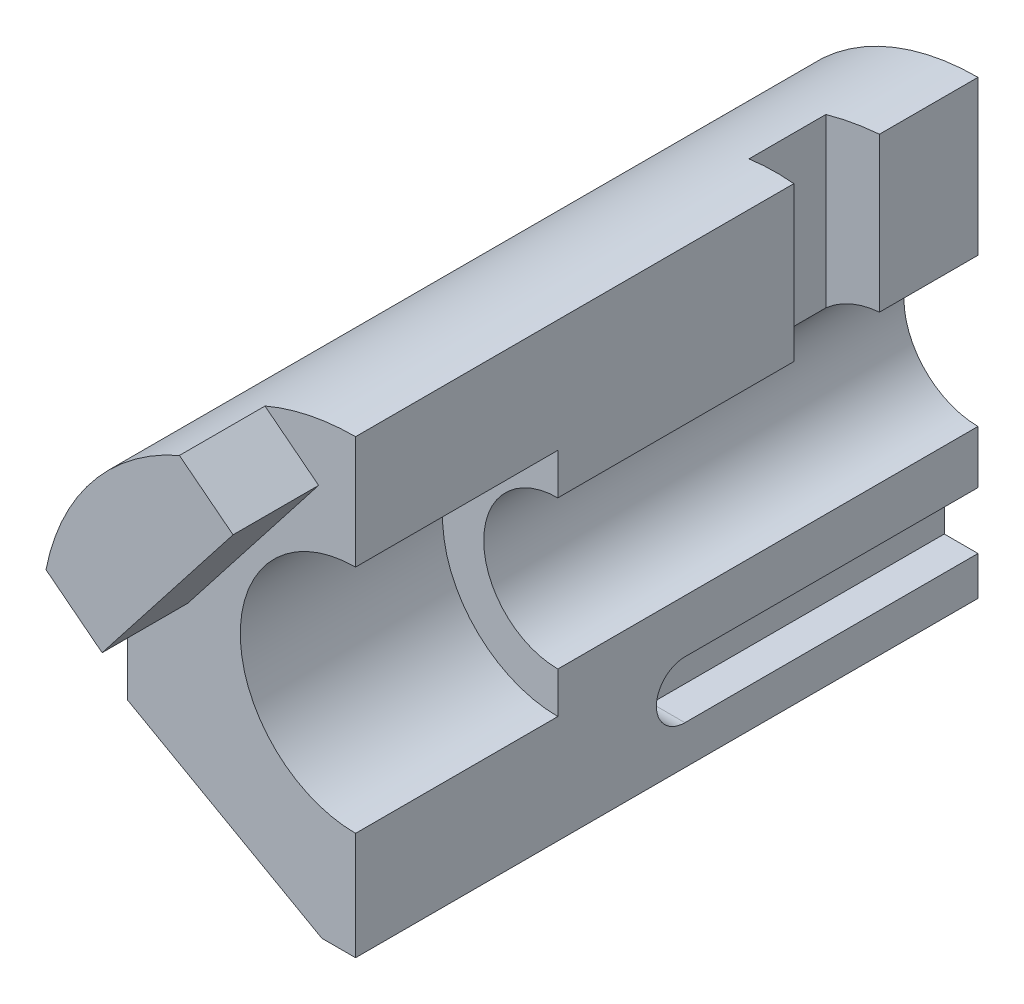
ISO-10303-21;
HEADER;
FILE_DESCRIPTION(('STEP AP214'),'2;1');
FILE_NAME('part.step','',(''),(''),'','','');
FILE_SCHEMA(('AUTOMOTIVE_DESIGN { 1 0 10303 214 1 1 1 1 }'));
ENDSEC;
DATA;
#1=APPLICATION_CONTEXT('core data for automotive mechanical design processes');
#2=APPLICATION_PROTOCOL_DEFINITION('international standard','automotive_design',2000,#1);
#3=PRODUCT_CONTEXT('',#1,'mechanical');
#4=PRODUCT('Part','Part','',(#3));
#5=PRODUCT_RELATED_PRODUCT_CATEGORY('part','',(#4));
#6=PRODUCT_DEFINITION_FORMATION('','',#4);
#7=PRODUCT_DEFINITION_CONTEXT('part definition',#1,'design');
#8=PRODUCT_DEFINITION('design','',#6,#7);
#9=PRODUCT_DEFINITION_SHAPE('','',#8);
#10=(LENGTH_UNIT() NAMED_UNIT(*) SI_UNIT(.MILLI.,.METRE.));
#11=(NAMED_UNIT(*) PLANE_ANGLE_UNIT() SI_UNIT($,.RADIAN.));
#12=(NAMED_UNIT(*) SI_UNIT($,.STERADIAN.) SOLID_ANGLE_UNIT());
#13=UNCERTAINTY_MEASURE_WITH_UNIT(LENGTH_MEASURE(1.E-05),#10,'distance_accuracy_value','');
#14=(GEOMETRIC_REPRESENTATION_CONTEXT(3) GLOBAL_UNCERTAINTY_ASSIGNED_CONTEXT((#13)) GLOBAL_UNIT_ASSIGNED_CONTEXT((#10,
#11,#12)) REPRESENTATION_CONTEXT('',''));
#15=CARTESIAN_POINT('',(0.,0.,0.));
#16=DIRECTION('',(0.,0.,1.));
#17=DIRECTION('',(1.,0.,0.));
#18=AXIS2_PLACEMENT_3D('',#15,#16,#17);
#19=CARTESIAN_POINT('',(0.,-86.,240.));
#20=DIRECTION('',(-1.,0.,0.));
#21=DIRECTION('',(0.,0.,1.));
#22=AXIS2_PLACEMENT_3D('',#19,#20,#21);
#23=PLANE('',#22);
#24=DIRECTION('',(0.,0.,-1.));
#25=VECTOR('',#24,1.);
#26=CARTESIAN_POINT('',(0.,-49.,0.));
#27=LINE('',#26,#25);
#28=CARTESIAN_POINT('',(0.,-49.,113.));
#29=VERTEX_POINT('',#28);
#30=CARTESIAN_POINT('',(0.,-49.,0.));
#31=VERTEX_POINT('',#30);
#32=EDGE_CURVE('E196',#29,#31,#27,.T.);
#33=ORIENTED_EDGE('',*,*,#32,.T.);
#34=DIRECTION('',(0.,1.,0.));
#35=VECTOR('',#34,1.);
#36=CARTESIAN_POINT('',(0.,-86.,0.));
#37=LINE('',#36,#35);
#38=CARTESIAN_POINT('',(0.,-28.575,0.));
#39=VERTEX_POINT('',#38);
#40=EDGE_CURVE('E320',#31,#39,#37,.T.);
#41=ORIENTED_EDGE('',*,*,#40,.T.);
#42=DIRECTION('',(0.,0.,1.));
#43=VECTOR('',#42,1.);
#44=CARTESIAN_POINT('',(0.,-28.575,0.));
#45=LINE('',#44,#43);
#46=CARTESIAN_POINT('',(0.,-28.575,162.));
#47=VERTEX_POINT('',#46);
#48=EDGE_CURVE('E279',#39,#47,#45,.T.);
#49=ORIENTED_EDGE('',*,*,#48,.T.);
#50=DIRECTION('',(0.,1.,0.));
#51=VECTOR('',#50,1.);
#52=CARTESIAN_POINT('',(0.,-86.,162.));
#53=LINE('',#52,#51);
#54=CARTESIAN_POINT('',(0.,-44.45,162.));
#55=VERTEX_POINT('',#54);
#56=EDGE_CURVE('E337',#55,#47,#53,.T.);
#57=ORIENTED_EDGE('',*,*,#56,.F.);
#58=DIRECTION('',(0.,0.,1.));
#59=VECTOR('',#58,1.);
#60=CARTESIAN_POINT('',(0.,-44.45,162.));
#61=LINE('',#60,#59);
#62=CARTESIAN_POINT('',(0.,-44.45,240.));
#63=VERTEX_POINT('',#62);
#64=EDGE_CURVE('E290',#55,#63,#61,.T.);
#65=ORIENTED_EDGE('',*,*,#64,.T.);
#66=DIRECTION('',(0.,1.,0.));
#67=VECTOR('',#66,1.);
#68=CARTESIAN_POINT('',(0.,-86.,240.));
#69=LINE('',#68,#67);
#70=CARTESIAN_POINT('',(0.,-86.,240.));
#71=VERTEX_POINT('',#70);
#72=EDGE_CURVE('E304',#71,#63,#69,.T.);
#73=ORIENTED_EDGE('',*,*,#72,.F.);
#74=DIRECTION('',(0.,0.,-1.));
#75=VECTOR('',#74,1.);
#76=CARTESIAN_POINT('',(0.,-86.,240.));
#77=LINE('',#76,#75);
#78=CARTESIAN_POINT('',(0.,-86.,0.));
#79=VERTEX_POINT('',#78);
#80=EDGE_CURVE('E324',#71,#79,#77,.T.);
#81=ORIENTED_EDGE('',*,*,#80,.T.);
#82=CARTESIAN_POINT('',(0.,-71.,0.));
#83=VERTEX_POINT('',#82);
#84=EDGE_CURVE('E317',#79,#83,#37,.T.);
#85=ORIENTED_EDGE('',*,*,#84,.T.);
#86=DIRECTION('',(0.,0.,-1.));
#87=VECTOR('',#86,1.);
#88=CARTESIAN_POINT('',(0.,-71.,0.));
#89=LINE('',#88,#87);
#90=CARTESIAN_POINT('',(0.,-71.,113.));
#91=VERTEX_POINT('',#90);
#92=EDGE_CURVE('E208',#91,#83,#89,.T.);
#93=ORIENTED_EDGE('',*,*,#92,.F.);
#94=CARTESIAN_POINT('',(0.,-60.,113.));
#95=DIRECTION('',(1.,0.,0.));
#96=DIRECTION('',(0.,0.,-1.));
#97=AXIS2_PLACEMENT_3D('',#94,#95,#96);
#98=CIRCLE('',#97,11.);
#99=EDGE_CURVE('E216',#29,#91,#98,.T.);
#100=ORIENTED_EDGE('',*,*,#99,.F.);
#101=EDGE_LOOP('',(#33,#41,#49,#57,#65,#73,#81,#85,#93,#100));
#102=FACE_BOUND('',#101,.T.);
#103=ADVANCED_FACE('F47',(#102),#23,.F.);
#104=CARTESIAN_POINT('',(0.,0.,0.));
#105=DIRECTION('',(0.,0.,1.));
#106=DIRECTION('',(1.,0.,0.));
#107=AXIS2_PLACEMENT_3D('',#104,#105,#106);
#108=PLANE('',#107);
#109=DIRECTION('',(1.,0.,0.));
#110=VECTOR('',#109,1.);
#111=CARTESIAN_POINT('',(-13.,-49.,0.));
#112=LINE('',#111,#110);
#113=CARTESIAN_POINT('',(-13.,-49.,0.));
#114=VERTEX_POINT('',#113);
#115=EDGE_CURVE('E219',#114,#31,#112,.T.);
#116=ORIENTED_EDGE('',*,*,#115,.F.);
#117=DIRECTION('',(0.,1.,0.));
#118=VECTOR('',#117,1.);
#119=CARTESIAN_POINT('',(-13.,0.,0.));
#120=LINE('',#119,#118);
#121=CARTESIAN_POINT('',(-13.,-71.,0.));
#122=VERTEX_POINT('',#121);
#123=EDGE_CURVE('E202',#122,#114,#120,.T.);
#124=ORIENTED_EDGE('',*,*,#123,.F.);
#125=DIRECTION('',(1.,0.,0.));
#126=VECTOR('',#125,1.);
#127=CARTESIAN_POINT('',(-13.,-71.,0.));
#128=LINE('',#127,#126);
#129=EDGE_CURVE('E222',#122,#83,#128,.T.);
#130=ORIENTED_EDGE('',*,*,#129,.T.);
#131=ORIENTED_EDGE('',*,*,#84,.F.);
#132=DIRECTION('',(1.,0.,0.));
#133=VECTOR('',#132,1.);
#134=CARTESIAN_POINT('',(0.,-86.,0.));
#135=LINE('',#134,#133);
#136=CARTESIAN_POINT('',(-13.,-86.,0.));
#137=VERTEX_POINT('',#136);
#138=EDGE_CURVE('E314',#137,#79,#135,.T.);
#139=ORIENTED_EDGE('',*,*,#138,.F.);
#140=DIRECTION('',(0.871778755489481,-0.489899787178166,0.));
#141=VECTOR('',#140,1.);
#142=CARTESIAN_POINT('',(-13.,-86.,0.));
#143=LINE('',#142,#141);
#144=CARTESIAN_POINT('',(-88.,-43.8534303491572,0.));
#145=VERTEX_POINT('',#144);
#146=EDGE_CURVE('E312',#145,#137,#143,.T.);
#147=ORIENTED_EDGE('',*,*,#146,.F.);
#148=DIRECTION('',(0.,-1.,0.));
#149=VECTOR('',#148,1.);
#150=CARTESIAN_POINT('',(-88.,0.,0.));
#151=LINE('',#150,#149);
#152=CARTESIAN_POINT('',(-88.,0.,0.));
#153=VERTEX_POINT('',#152);
#154=EDGE_CURVE('E310',#153,#145,#151,.T.);
#155=ORIENTED_EDGE('',*,*,#154,.F.);
#156=CARTESIAN_POINT('',(0.,0.,0.));
#157=DIRECTION('',(0.,0.,1.));
#158=DIRECTION('',(1.,0.,0.));
#159=AXIS2_PLACEMENT_3D('',#156,#157,#158);
#160=CIRCLE('',#159,88.);
#161=CARTESIAN_POINT('',(0.,88.,0.));
#162=VERTEX_POINT('',#161);
#163=EDGE_CURVE('E293',#162,#153,#160,.T.);
#164=ORIENTED_EDGE('',*,*,#163,.F.);
#165=CARTESIAN_POINT('',(0.,28.575,0.));
#166=VERTEX_POINT('',#165);
#167=EDGE_CURVE('E316',#166,#162,#37,.T.);
#168=ORIENTED_EDGE('',*,*,#167,.F.);
#169=CARTESIAN_POINT('',(0.,0.,0.));
#170=DIRECTION('',(0.,0.,1.));
#171=DIRECTION('',(1.,0.,0.));
#172=AXIS2_PLACEMENT_3D('',#169,#170,#171);
#173=CIRCLE('',#172,28.575);
#174=EDGE_CURVE('E271',#166,#39,#173,.T.);
#175=ORIENTED_EDGE('',*,*,#174,.T.);
#176=ORIENTED_EDGE('',*,*,#40,.F.);
#177=EDGE_LOOP('',(#116,#124,#130,#131,#139,#147,#155,#164,#168,#175,#176));
#178=FACE_BOUND('',#177,.T.);
#179=ADVANCED_FACE('F375',(#178),#108,.F.);
#180=DIRECTION('',(0.,0.,-1.));
#181=VECTOR('',#180,1.);
#182=CARTESIAN_POINT('',(0.,88.,240.));
#183=LINE('',#182,#181);
#184=CARTESIAN_POINT('',(0.,88.,38.));
#185=VERTEX_POINT('',#184);
#186=EDGE_CURVE('E307',#185,#162,#183,.T.);
#187=ORIENTED_EDGE('',*,*,#186,.F.);
#188=DIRECTION('',(0.,1.,0.));
#189=VECTOR('',#188,1.);
#190=CARTESIAN_POINT('',(0.,4.33599972747388,38.));
#191=LINE('',#190,#189);
#192=CARTESIAN_POINT('',(0.,28.575,38.));
#193=VERTEX_POINT('',#192);
#194=EDGE_CURVE('E221',#193,#185,#191,.T.);
#195=ORIENTED_EDGE('',*,*,#194,.F.);
#196=DIRECTION('',(0.,0.,1.));
#197=VECTOR('',#196,1.);
#198=CARTESIAN_POINT('',(0.,28.575,0.));
#199=LINE('',#198,#197);
#200=EDGE_CURVE('E274',#193,#166,#199,.F.);
#201=ORIENTED_EDGE('',*,*,#200,.T.);
#202=ORIENTED_EDGE('',*,*,#167,.T.);
#203=EDGE_LOOP('',(#187,#195,#201,#202));
#204=FACE_BOUND('',#203,.T.);
#205=ADVANCED_FACE('F387',(#204),#23,.F.);
#206=CARTESIAN_POINT('',(0.,0.,240.));
#207=DIRECTION('',(0.,0.,1.));
#208=DIRECTION('',(1.,0.,0.));
#209=AXIS2_PLACEMENT_3D('',#206,#207,#208);
#210=PLANE('',#209);
#211=DIRECTION('',(0.61566147532566,0.788010753606721,0.));
#212=VECTOR('',#211,1.);
#213=CARTESIAN_POINT('',(-40.1885484339428,31.3987352416086,240.));
#214=LINE('',#213,#212);
#215=CARTESIAN_POINT('',(-64.7199289687016,0.,240.));
#216=VERTEX_POINT('',#215);
#217=CARTESIAN_POINT('',(-14.2356879919975,64.6168817957511,240.));
#218=VERTEX_POINT('',#217);
#219=EDGE_CURVE('E254',#216,#218,#214,.T.);
#220=ORIENTED_EDGE('',*,*,#219,.F.);
#221=DIRECTION('',(-0.788010753606721,0.61566147532566,0.));
#222=VECTOR('',#221,1.);
#223=CARTESIAN_POINT('',(-24.5313805347588,-31.3987352416086,240.));
#224=LINE('',#223,#222);
#225=CARTESIAN_POINT('',(-86.3605080151727,16.9074733582903,240.));
#226=VERTEX_POINT('',#225);
#227=EDGE_CURVE('E241',#216,#226,#224,.T.);
#228=ORIENTED_EDGE('',*,*,#227,.T.);
#229=CARTESIAN_POINT('',(0.,0.,240.));
#230=DIRECTION('',(0.,0.,1.));
#231=DIRECTION('',(1.,0.,0.));
#232=AXIS2_PLACEMENT_3D('',#229,#230,#231);
#233=CIRCLE('',#232,88.);
#234=CARTESIAN_POINT('',(-88.,0.,240.));
#235=VERTEX_POINT('',#234);
#236=EDGE_CURVE('E297',#226,#235,#233,.T.);
#237=ORIENTED_EDGE('',*,*,#236,.T.);
#238=DIRECTION('',(0.,-1.,0.));
#239=VECTOR('',#238,1.);
#240=CARTESIAN_POINT('',(-88.,0.,240.));
#241=LINE('',#240,#239);
#242=CARTESIAN_POINT('',(-88.,-43.8534303491572,240.));
#243=VERTEX_POINT('',#242);
#244=EDGE_CURVE('E296',#235,#243,#241,.T.);
#245=ORIENTED_EDGE('',*,*,#244,.T.);
#246=DIRECTION('',(0.871778755489481,-0.489899787178166,0.));
#247=VECTOR('',#246,1.);
#248=CARTESIAN_POINT('',(-13.,-86.,240.));
#249=LINE('',#248,#247);
#250=CARTESIAN_POINT('',(-13.,-86.,240.));
#251=VERTEX_POINT('',#250);
#252=EDGE_CURVE('E299',#243,#251,#249,.T.);
#253=ORIENTED_EDGE('',*,*,#252,.T.);
#254=DIRECTION('',(1.,0.,0.));
#255=VECTOR('',#254,1.);
#256=CARTESIAN_POINT('',(0.,-86.,240.));
#257=LINE('',#256,#255);
#258=EDGE_CURVE('E301',#251,#71,#257,.T.);
#259=ORIENTED_EDGE('',*,*,#258,.T.);
#260=ORIENTED_EDGE('',*,*,#72,.T.);
#261=CARTESIAN_POINT('',(0.,0.,240.));
#262=DIRECTION('',(0.,0.,1.));
#263=DIRECTION('',(1.,0.,0.));
#264=AXIS2_PLACEMENT_3D('',#261,#262,#263);
#265=CIRCLE('',#264,44.45);
#266=CARTESIAN_POINT('',(0.,44.45,240.));
#267=VERTEX_POINT('',#266);
#268=EDGE_CURVE('E282',#267,#63,#265,.T.);
#269=ORIENTED_EDGE('',*,*,#268,.F.);
#270=CARTESIAN_POINT('',(0.,88.,240.));
#271=VERTEX_POINT('',#270);
#272=EDGE_CURVE('E303',#267,#271,#69,.T.);
#273=ORIENTED_EDGE('',*,*,#272,.T.);
#274=CARTESIAN_POINT('',(-34.9181204871429,80.7757690254037,240.));
#275=VERTEX_POINT('',#274);
#276=EDGE_CURVE('E294',#271,#275,#233,.T.);
#277=ORIENTED_EDGE('',*,*,#276,.T.);
#278=DIRECTION('',(-0.788010753606722,0.615661475325659,0.));
#279=VECTOR('',#278,1.);
#280=CARTESIAN_POINT('',(25.9528604419453,33.2181465541426,240.));
#281=LINE('',#280,#279);
#282=EDGE_CURVE('E246',#218,#275,#281,.T.);
#283=ORIENTED_EDGE('',*,*,#282,.F.);
#284=EDGE_LOOP('',(#220,#228,#237,#245,#253,#259,#260,#269,#273,#277,#283));
#285=FACE_BOUND('',#284,.T.);
#286=ADVANCED_FACE('F364',(#285),#210,.T.);
#287=CARTESIAN_POINT('',(0.,0.,240.));
#288=DIRECTION('',(0.,0.,-1.));
#289=DIRECTION('',(-1.,0.,0.));
#290=AXIS2_PLACEMENT_3D('',#287,#288,#289);
#291=CYLINDRICAL_SURFACE('',#290,88.);
#292=DIRECTION('',(0.,0.,-1.));
#293=VECTOR('',#292,1.);
#294=CARTESIAN_POINT('',(-19.,85.9243853629457,240.));
#295=LINE('',#294,#293);
#296=CARTESIAN_POINT('',(-19.,85.9243853629457,39.6622846069926));
#297=VERTEX_POINT('',#296);
#298=CARTESIAN_POINT('',(-19.,85.9243853629457,69.3377153930075));
#299=VERTEX_POINT('',#298);
#300=EDGE_CURVE('E233',#297,#299,#295,.F.);
#301=ORIENTED_EDGE('',*,*,#300,.F.);
#302=CARTESIAN_POINT('',(0.,0.,38.));
#303=DIRECTION('',(-0.0871557427476584,0.,-0.996194698091745));
#304=DIRECTION('',(0.996194698091746,0.,-0.0871557427476584));
#305=AXIS2_PLACEMENT_3D('',#302,#303,#304);
#306=ELLIPSE('',#305,88.3361457038146,88.);
#307=EDGE_CURVE('E238',#297,#185,#306,.T.);
#308=ORIENTED_EDGE('',*,*,#307,.T.);
#309=ORIENTED_EDGE('',*,*,#186,.T.);
#310=ORIENTED_EDGE('',*,*,#163,.T.);
#311=DIRECTION('',(0.,0.,-1.));
#312=VECTOR('',#311,1.);
#313=CARTESIAN_POINT('',(-88.,0.,240.));
#314=LINE('',#313,#312);
#315=EDGE_CURVE('E333',#235,#153,#314,.T.);
#316=ORIENTED_EDGE('',*,*,#315,.F.);
#317=ORIENTED_EDGE('',*,*,#236,.F.);
#318=DIRECTION('',(0.,0.,-1.));
#319=VECTOR('',#318,1.);
#320=CARTESIAN_POINT('',(-86.3605080151727,16.9074733582903,273.));
#321=LINE('',#320,#319);
#322=CARTESIAN_POINT('',(-86.3605080151727,16.9074733582903,273.));
#323=VERTEX_POINT('',#322);
#324=EDGE_CURVE('E252',#323,#226,#321,.T.);
#325=ORIENTED_EDGE('',*,*,#324,.F.);
#326=CARTESIAN_POINT('',(0.,0.,273.));
#327=DIRECTION('',(0.,0.,1.));
#328=DIRECTION('',(1.,0.,0.));
#329=AXIS2_PLACEMENT_3D('',#326,#327,#328);
#330=CIRCLE('',#329,88.);
#331=CARTESIAN_POINT('',(-34.9181204871429,80.7757690254037,273.));
#332=VERTEX_POINT('',#331);
#333=EDGE_CURVE('E250',#332,#323,#330,.T.);
#334=ORIENTED_EDGE('',*,*,#333,.F.);
#335=DIRECTION('',(0.,0.,-1.));
#336=VECTOR('',#335,1.);
#337=CARTESIAN_POINT('',(-34.9181204871429,80.7757690254037,273.));
#338=LINE('',#337,#336);
#339=EDGE_CURVE('E261',#332,#275,#338,.T.);
#340=ORIENTED_EDGE('',*,*,#339,.T.);
#341=ORIENTED_EDGE('',*,*,#276,.F.);
#342=CARTESIAN_POINT('',(0.,88.,71.));
#343=VERTEX_POINT('',#342);
#344=EDGE_CURVE('E321',#271,#343,#183,.T.);
#345=ORIENTED_EDGE('',*,*,#344,.T.);
#346=CARTESIAN_POINT('',(0.,0.,71.));
#347=DIRECTION('',(-0.0871557427476584,0.,0.996194698091745));
#348=DIRECTION('',(-0.996194698091746,0.,-0.0871557427476584));
#349=AXIS2_PLACEMENT_3D('',#346,#347,#348);
#350=ELLIPSE('',#349,88.3361457038146,88.);
#351=EDGE_CURVE('E235',#343,#299,#350,.T.);
#352=ORIENTED_EDGE('',*,*,#351,.T.);
#353=EDGE_LOOP('',(#301,#308,#309,#310,#316,#317,#325,#334,#340,#341,#345,#352));
#354=FACE_BOUND('',#353,.T.);
#355=ADVANCED_FACE('F49',(#354),#291,.T.);
#356=CARTESIAN_POINT('',(-88.,0.,240.));
#357=DIRECTION('',(1.,0.,0.));
#358=DIRECTION('',(0.,0.,-1.));
#359=AXIS2_PLACEMENT_3D('',#356,#357,#358);
#360=PLANE('',#359);
#361=ORIENTED_EDGE('',*,*,#154,.T.);
#362=DIRECTION('',(0.,0.,-1.));
#363=VECTOR('',#362,1.);
#364=CARTESIAN_POINT('',(-88.,-43.8534303491572,240.));
#365=LINE('',#364,#363);
#366=EDGE_CURVE('E330',#243,#145,#365,.T.);
#367=ORIENTED_EDGE('',*,*,#366,.F.);
#368=ORIENTED_EDGE('',*,*,#244,.F.);
#369=ORIENTED_EDGE('',*,*,#315,.T.);
#370=EDGE_LOOP('',(#361,#367,#368,#369));
#371=FACE_BOUND('',#370,.T.);
#372=ADVANCED_FACE('F446',(#371),#360,.F.);
#373=CARTESIAN_POINT('',(-13.,-86.,240.));
#374=DIRECTION('',(0.489899787178166,0.871778755489481,0.));
#375=DIRECTION('',(-0.871778755489481,0.489899787178166,0.));
#376=AXIS2_PLACEMENT_3D('',#373,#374,#375);
#377=PLANE('',#376);
#378=ORIENTED_EDGE('',*,*,#146,.T.);
#379=DIRECTION('',(0.,0.,-1.));
#380=VECTOR('',#379,1.);
#381=CARTESIAN_POINT('',(-13.,-86.,240.));
#382=LINE('',#381,#380);
#383=EDGE_CURVE('E327',#251,#137,#382,.T.);
#384=ORIENTED_EDGE('',*,*,#383,.F.);
#385=ORIENTED_EDGE('',*,*,#252,.F.);
#386=ORIENTED_EDGE('',*,*,#366,.T.);
#387=EDGE_LOOP('',(#378,#384,#385,#386));
#388=FACE_BOUND('',#387,.T.);
#389=ADVANCED_FACE('F441',(#388),#377,.F.);
#390=CARTESIAN_POINT('',(0.,-86.,240.));
#391=DIRECTION('',(0.,1.,0.));
#392=DIRECTION('',(0.,0.,1.));
#393=AXIS2_PLACEMENT_3D('',#390,#391,#392);
#394=PLANE('',#393);
#395=ORIENTED_EDGE('',*,*,#138,.T.);
#396=ORIENTED_EDGE('',*,*,#80,.F.);
#397=ORIENTED_EDGE('',*,*,#258,.F.);
#398=ORIENTED_EDGE('',*,*,#383,.T.);
#399=EDGE_LOOP('',(#395,#396,#397,#398));
#400=FACE_BOUND('',#399,.T.);
#401=ADVANCED_FACE('F370',(#400),#394,.F.);
#402=CARTESIAN_POINT('',(0.,28.575,162.));
#403=VERTEX_POINT('',#402);
#404=CARTESIAN_POINT('',(0.,28.575,71.));
#405=VERTEX_POINT('',#404);
#406=EDGE_CURVE('E276',#403,#405,#199,.F.);
#407=ORIENTED_EDGE('',*,*,#406,.T.);
#408=DIRECTION('',(0.,-1.,0.));
#409=VECTOR('',#408,1.);
#410=CARTESIAN_POINT('',(0.,94.3359997274739,71.));
#411=LINE('',#410,#409);
#412=EDGE_CURVE('E227',#343,#405,#411,.T.);
#413=ORIENTED_EDGE('',*,*,#412,.F.);
#414=ORIENTED_EDGE('',*,*,#344,.F.);
#415=ORIENTED_EDGE('',*,*,#272,.F.);
#416=DIRECTION('',(0.,0.,1.));
#417=VECTOR('',#416,1.);
#418=CARTESIAN_POINT('',(0.,44.45,162.));
#419=LINE('',#418,#417);
#420=CARTESIAN_POINT('',(0.,44.45,162.));
#421=VERTEX_POINT('',#420);
#422=EDGE_CURVE('E286',#267,#421,#419,.F.);
#423=ORIENTED_EDGE('',*,*,#422,.T.);
#424=EDGE_CURVE('E336',#403,#421,#53,.T.);
#425=ORIENTED_EDGE('',*,*,#424,.F.);
#426=EDGE_LOOP('',(#407,#413,#414,#415,#423,#425));
#427=FACE_BOUND('',#426,.T.);
#428=ADVANCED_FACE('F351',(#427),#23,.F.);
#429=CARTESIAN_POINT('',(0.,0.,162.));
#430=DIRECTION('',(0.,0.,1.));
#431=DIRECTION('',(1.,0.,0.));
#432=AXIS2_PLACEMENT_3D('',#429,#430,#431);
#433=PLANE('',#432);
#434=CARTESIAN_POINT('',(0.,0.,162.));
#435=DIRECTION('',(0.,0.,1.));
#436=DIRECTION('',(1.,0.,0.));
#437=AXIS2_PLACEMENT_3D('',#434,#435,#436);
#438=CIRCLE('',#437,28.575);
#439=EDGE_CURVE('E270',#403,#47,#438,.T.);
#440=ORIENTED_EDGE('',*,*,#439,.F.);
#441=ORIENTED_EDGE('',*,*,#424,.T.);
#442=CARTESIAN_POINT('',(0.,0.,162.));
#443=DIRECTION('',(0.,0.,1.));
#444=DIRECTION('',(1.,0.,0.));
#445=AXIS2_PLACEMENT_3D('',#442,#443,#444);
#446=CIRCLE('',#445,44.45);
#447=EDGE_CURVE('E283',#421,#55,#446,.T.);
#448=ORIENTED_EDGE('',*,*,#447,.T.);
#449=ORIENTED_EDGE('',*,*,#56,.T.);
#450=EDGE_LOOP('',(#440,#441,#448,#449));
#451=FACE_BOUND('',#450,.T.);
#452=ADVANCED_FACE('F356',(#451),#433,.T.);
#453=CARTESIAN_POINT('',(0.,0.,162.));
#454=DIRECTION('',(0.,0.,1.));
#455=DIRECTION('',(1.,0.,0.));
#456=AXIS2_PLACEMENT_3D('',#453,#454,#455);
#457=CYLINDRICAL_SURFACE('',#456,44.45);
#458=ORIENTED_EDGE('',*,*,#447,.F.);
#459=ORIENTED_EDGE('',*,*,#422,.F.);
#460=ORIENTED_EDGE('',*,*,#268,.T.);
#461=ORIENTED_EDGE('',*,*,#64,.F.);
#462=EDGE_LOOP('',(#458,#459,#460,#461));
#463=FACE_BOUND('',#462,.T.);
#464=ADVANCED_FACE('F359',(#463),#457,.F.);
#465=CARTESIAN_POINT('',(0.,0.,0.));
#466=DIRECTION('',(0.,0.,1.));
#467=DIRECTION('',(1.,0.,0.));
#468=AXIS2_PLACEMENT_3D('',#465,#466,#467);
#469=CYLINDRICAL_SURFACE('',#468,28.575);
#470=ORIENTED_EDGE('',*,*,#200,.F.);
#471=CARTESIAN_POINT('',(0.,0.,38.));
#472=DIRECTION('',(-0.0871557427476584,0.,-0.996194698091745));
#473=DIRECTION('',(-0.996194698091746,0.,0.0871557427476584));
#474=AXIS2_PLACEMENT_3D('',#471,#472,#473);
#475=ELLIPSE('',#474,28.6841518578012,28.575);
#476=CARTESIAN_POINT('',(-19.,21.3431634253219,39.6622846069926));
#477=VERTEX_POINT('',#476);
#478=EDGE_CURVE('E11',#193,#477,#475,.F.);
#479=ORIENTED_EDGE('',*,*,#478,.T.);
#480=DIRECTION('',(0.,0.,1.));
#481=VECTOR('',#480,1.);
#482=CARTESIAN_POINT('',(-19.,21.3431634253219,0.));
#483=LINE('',#482,#481);
#484=CARTESIAN_POINT('',(-19.,21.3431634253219,69.3377153930075));
#485=VERTEX_POINT('',#484);
#486=EDGE_CURVE('E340',#485,#477,#483,.F.);
#487=ORIENTED_EDGE('',*,*,#486,.F.);
#488=CARTESIAN_POINT('',(0.,0.,71.));
#489=DIRECTION('',(-0.0871557427476584,0.,0.996194698091745));
#490=DIRECTION('',(0.996194698091746,0.,0.0871557427476584));
#491=AXIS2_PLACEMENT_3D('',#488,#489,#490);
#492=ELLIPSE('',#491,28.6841518578012,28.575);
#493=EDGE_CURVE('E55',#485,#405,#492,.F.);
#494=ORIENTED_EDGE('',*,*,#493,.T.);
#495=ORIENTED_EDGE('',*,*,#406,.F.);
#496=ORIENTED_EDGE('',*,*,#439,.T.);
#497=ORIENTED_EDGE('',*,*,#48,.F.);
#498=ORIENTED_EDGE('',*,*,#174,.F.);
#499=EDGE_LOOP('',(#470,#479,#487,#494,#495,#496,#497,#498));
#500=FACE_BOUND('',#499,.T.);
#501=ADVANCED_FACE('F345',(#500),#469,.F.);
#502=CARTESIAN_POINT('',(-24.5313805347588,-31.3987352416086,273.));
#503=DIRECTION('',(-0.615661475325659,-0.788010753606721,0.));
#504=DIRECTION('',(0.788010753606721,-0.615661475325659,0.));
#505=AXIS2_PLACEMENT_3D('',#502,#503,#504);
#506=PLANE('',#505);
#507=ORIENTED_EDGE('',*,*,#227,.F.);
#508=DIRECTION('',(0.,0.,-1.));
#509=VECTOR('',#508,1.);
#510=CARTESIAN_POINT('',(-64.7199289687016,0.,273.));
#511=LINE('',#510,#509);
#512=CARTESIAN_POINT('',(-64.7199289687016,0.,273.));
#513=VERTEX_POINT('',#512);
#514=EDGE_CURVE('E267',#513,#216,#511,.T.);
#515=ORIENTED_EDGE('',*,*,#514,.F.);
#516=DIRECTION('',(-0.788010753606721,0.61566147532566,0.));
#517=VECTOR('',#516,1.);
#518=CARTESIAN_POINT('',(-24.5313805347588,-31.3987352416086,273.));
#519=LINE('',#518,#517);
#520=EDGE_CURVE('E242',#513,#323,#519,.T.);
#521=ORIENTED_EDGE('',*,*,#520,.T.);
#522=ORIENTED_EDGE('',*,*,#324,.T.);
#523=EDGE_LOOP('',(#507,#515,#521,#522));
#524=FACE_BOUND('',#523,.T.);
#525=ADVANCED_FACE('F415',(#524),#506,.T.);
#526=CARTESIAN_POINT('',(-40.1885484339428,31.3987352416086,273.));
#527=DIRECTION('',(-0.788010753606721,0.61566147532566,0.));
#528=DIRECTION('',(-0.61566147532566,-0.788010753606721,0.));
#529=AXIS2_PLACEMENT_3D('',#526,#527,#528);
#530=PLANE('',#529);
#531=ORIENTED_EDGE('',*,*,#219,.T.);
#532=DIRECTION('',(0.,0.,-1.));
#533=VECTOR('',#532,1.);
#534=CARTESIAN_POINT('',(-14.2356879919975,64.6168817957511,273.));
#535=LINE('',#534,#533);
#536=CARTESIAN_POINT('',(-14.2356879919975,64.6168817957511,273.));
#537=VERTEX_POINT('',#536);
#538=EDGE_CURVE('E264',#537,#218,#535,.T.);
#539=ORIENTED_EDGE('',*,*,#538,.F.);
#540=DIRECTION('',(0.61566147532566,0.788010753606721,0.));
#541=VECTOR('',#540,1.);
#542=CARTESIAN_POINT('',(-40.1885484339428,31.3987352416086,273.));
#543=LINE('',#542,#541);
#544=EDGE_CURVE('E245',#513,#537,#543,.T.);
#545=ORIENTED_EDGE('',*,*,#544,.F.);
#546=ORIENTED_EDGE('',*,*,#514,.T.);
#547=EDGE_LOOP('',(#531,#539,#545,#546));
#548=FACE_BOUND('',#547,.T.);
#549=ADVANCED_FACE('F411',(#548),#530,.F.);
#550=CARTESIAN_POINT('',(25.9528604419453,33.2181465541426,273.));
#551=DIRECTION('',(-0.615661475325658,-0.788010753606722,0.));
#552=DIRECTION('',(0.788010753606722,-0.615661475325659,0.));
#553=AXIS2_PLACEMENT_3D('',#550,#551,#552);
#554=PLANE('',#553);
#555=ORIENTED_EDGE('',*,*,#282,.T.);
#556=ORIENTED_EDGE('',*,*,#339,.F.);
#557=DIRECTION('',(-0.788010753606722,0.615661475325659,0.));
#558=VECTOR('',#557,1.);
#559=CARTESIAN_POINT('',(25.9528604419453,33.2181465541426,273.));
#560=LINE('',#559,#558);
#561=EDGE_CURVE('E248',#537,#332,#560,.T.);
#562=ORIENTED_EDGE('',*,*,#561,.F.);
#563=ORIENTED_EDGE('',*,*,#538,.T.);
#564=EDGE_LOOP('',(#555,#556,#562,#563));
#565=FACE_BOUND('',#564,.T.);
#566=ADVANCED_FACE('F401',(#565),#554,.F.);
#567=CARTESIAN_POINT('',(0.,0.,273.));
#568=DIRECTION('',(0.,0.,1.));
#569=DIRECTION('',(1.,0.,0.));
#570=AXIS2_PLACEMENT_3D('',#567,#568,#569);
#571=PLANE('',#570);
#572=ORIENTED_EDGE('',*,*,#520,.F.);
#573=ORIENTED_EDGE('',*,*,#544,.T.);
#574=ORIENTED_EDGE('',*,*,#561,.T.);
#575=ORIENTED_EDGE('',*,*,#333,.T.);
#576=EDGE_LOOP('',(#572,#573,#574,#575));
#577=FACE_BOUND('',#576,.T.);
#578=ADVANCED_FACE('F408',(#577),#571,.T.);
#579=CARTESIAN_POINT('',(0.,4.33599972747388,38.));
#580=DIRECTION('',(-0.0871557427476584,0.,-0.996194698091745));
#581=DIRECTION('',(-0.996194698091746,0.,0.0871557427476584));
#582=AXIS2_PLACEMENT_3D('',#579,#580,#581);
#583=PLANE('',#582);
#584=DIRECTION('',(0.,1.,0.));
#585=VECTOR('',#584,1.);
#586=CARTESIAN_POINT('',(-19.,0.,39.6622846069926));
#587=LINE('',#586,#585);
#588=EDGE_CURVE('E229',#477,#297,#587,.T.);
#589=ORIENTED_EDGE('',*,*,#588,.F.);
#590=ORIENTED_EDGE('',*,*,#478,.F.);
#591=ORIENTED_EDGE('',*,*,#194,.T.);
#592=ORIENTED_EDGE('',*,*,#307,.F.);
#593=EDGE_LOOP('',(#589,#590,#591,#592));
#594=FACE_BOUND('',#593,.T.);
#595=ADVANCED_FACE('F395',(#594),#583,.F.);
#596=CARTESIAN_POINT('',(0.,94.3359997274739,71.));
#597=DIRECTION('',(-0.0871557427476584,0.,0.996194698091745));
#598=DIRECTION('',(0.996194698091746,0.,0.0871557427476584));
#599=AXIS2_PLACEMENT_3D('',#596,#597,#598);
#600=PLANE('',#599);
#601=ORIENTED_EDGE('',*,*,#412,.T.);
#602=ORIENTED_EDGE('',*,*,#493,.F.);
#603=DIRECTION('',(0.,-1.,0.));
#604=VECTOR('',#603,1.);
#605=CARTESIAN_POINT('',(-19.,0.,69.3377153930074));
#606=LINE('',#605,#604);
#607=EDGE_CURVE('E70',#299,#485,#606,.T.);
#608=ORIENTED_EDGE('',*,*,#607,.F.);
#609=ORIENTED_EDGE('',*,*,#351,.F.);
#610=EDGE_LOOP('',(#601,#602,#608,#609));
#611=FACE_BOUND('',#610,.T.);
#612=ADVANCED_FACE('F397',(#611),#600,.F.);
#613=CARTESIAN_POINT('',(-19.,0.,0.));
#614=DIRECTION('',(1.,0.,0.));
#615=DIRECTION('',(0.,0.,-1.));
#616=AXIS2_PLACEMENT_3D('',#613,#614,#615);
#617=PLANE('',#616);
#618=ORIENTED_EDGE('',*,*,#300,.T.);
#619=ORIENTED_EDGE('',*,*,#607,.T.);
#620=ORIENTED_EDGE('',*,*,#486,.T.);
#621=ORIENTED_EDGE('',*,*,#588,.T.);
#622=EDGE_LOOP('',(#618,#619,#620,#621));
#623=FACE_BOUND('',#622,.T.);
#624=ADVANCED_FACE('F396',(#623),#617,.T.);
#625=CARTESIAN_POINT('',(-13.,-49.,0.));
#626=DIRECTION('',(0.,-1.,0.));
#627=DIRECTION('',(0.,0.,-1.));
#628=AXIS2_PLACEMENT_3D('',#625,#626,#627);
#629=PLANE('',#628);
#630=ORIENTED_EDGE('',*,*,#32,.F.);
#631=DIRECTION('',(1.,0.,0.));
#632=VECTOR('',#631,1.);
#633=CARTESIAN_POINT('',(-13.,-49.,113.));
#634=LINE('',#633,#632);
#635=CARTESIAN_POINT('',(-13.,-49.,113.));
#636=VERTEX_POINT('',#635);
#637=EDGE_CURVE('E191',#636,#29,#634,.T.);
#638=ORIENTED_EDGE('',*,*,#637,.F.);
#639=DIRECTION('',(0.,0.,-1.));
#640=VECTOR('',#639,1.);
#641=CARTESIAN_POINT('',(-13.,-49.,0.));
#642=LINE('',#641,#640);
#643=EDGE_CURVE('E194',#636,#114,#642,.T.);
#644=ORIENTED_EDGE('',*,*,#643,.T.);
#645=ORIENTED_EDGE('',*,*,#115,.T.);
#646=EDGE_LOOP('',(#630,#638,#644,#645));
#647=FACE_BOUND('',#646,.T.);
#648=ADVANCED_FACE('F193',(#647),#629,.T.);
#649=CARTESIAN_POINT('',(-13.,-71.,0.));
#650=DIRECTION('',(0.,-1.,0.));
#651=DIRECTION('',(0.,0.,-1.));
#652=AXIS2_PLACEMENT_3D('',#649,#650,#651);
#653=PLANE('',#652);
#654=ORIENTED_EDGE('',*,*,#92,.T.);
#655=ORIENTED_EDGE('',*,*,#129,.F.);
#656=DIRECTION('',(0.,0.,-1.));
#657=VECTOR('',#656,1.);
#658=CARTESIAN_POINT('',(-13.,-71.,0.));
#659=LINE('',#658,#657);
#660=CARTESIAN_POINT('',(-13.,-71.,113.));
#661=VERTEX_POINT('',#660);
#662=EDGE_CURVE('E62',#661,#122,#659,.T.);
#663=ORIENTED_EDGE('',*,*,#662,.F.);
#664=DIRECTION('',(1.,0.,0.));
#665=VECTOR('',#664,1.);
#666=CARTESIAN_POINT('',(-13.,-71.,113.));
#667=LINE('',#666,#665);
#668=EDGE_CURVE('E201',#661,#91,#667,.T.);
#669=ORIENTED_EDGE('',*,*,#668,.T.);
#670=EDGE_LOOP('',(#654,#655,#663,#669));
#671=FACE_BOUND('',#670,.T.);
#672=ADVANCED_FACE('F378',(#671),#653,.F.);
#673=CARTESIAN_POINT('',(-13.,-60.,113.));
#674=DIRECTION('',(1.,0.,0.));
#675=DIRECTION('',(0.,0.,-1.));
#676=AXIS2_PLACEMENT_3D('',#673,#674,#675);
#677=CYLINDRICAL_SURFACE('',#676,11.);
#678=ORIENTED_EDGE('',*,*,#99,.T.);
#679=ORIENTED_EDGE('',*,*,#668,.F.);
#680=CARTESIAN_POINT('',(-13.,-60.,113.));
#681=DIRECTION('',(1.,0.,0.));
#682=DIRECTION('',(0.,0.,-1.));
#683=AXIS2_PLACEMENT_3D('',#680,#681,#682);
#684=CIRCLE('',#683,11.);
#685=EDGE_CURVE('E205',#636,#661,#684,.T.);
#686=ORIENTED_EDGE('',*,*,#685,.F.);
#687=ORIENTED_EDGE('',*,*,#637,.T.);
#688=EDGE_LOOP('',(#678,#679,#686,#687));
#689=FACE_BOUND('',#688,.T.);
#690=ADVANCED_FACE('F210',(#689),#677,.F.);
#691=CARTESIAN_POINT('',(-13.,0.,0.));
#692=DIRECTION('',(1.,0.,0.));
#693=DIRECTION('',(0.,0.,-1.));
#694=AXIS2_PLACEMENT_3D('',#691,#692,#693);
#695=PLANE('',#694);
#696=ORIENTED_EDGE('',*,*,#643,.F.);
#697=ORIENTED_EDGE('',*,*,#685,.T.);
#698=ORIENTED_EDGE('',*,*,#662,.T.);
#699=ORIENTED_EDGE('',*,*,#123,.T.);
#700=EDGE_LOOP('',(#696,#697,#698,#699));
#701=FACE_BOUND('',#700,.T.);
#702=ADVANCED_FACE('F204',(#701),#695,.T.);
#703=CLOSED_SHELL('',(#103,#179,#205,#286,#355,#372,#389,#401,#428,#452,#464,#501,#525,#549,
#566,#578,#595,#612,#624,#648,#672,#690,#702));
#704=MANIFOLD_SOLID_BREP('B2',#703);
#705=ADVANCED_BREP_SHAPE_REPRESENTATION('',(#18,#704),#14);
#706=SHAPE_DEFINITION_REPRESENTATION(#9,#705);
ENDSEC;
END-ISO-10303-21;
